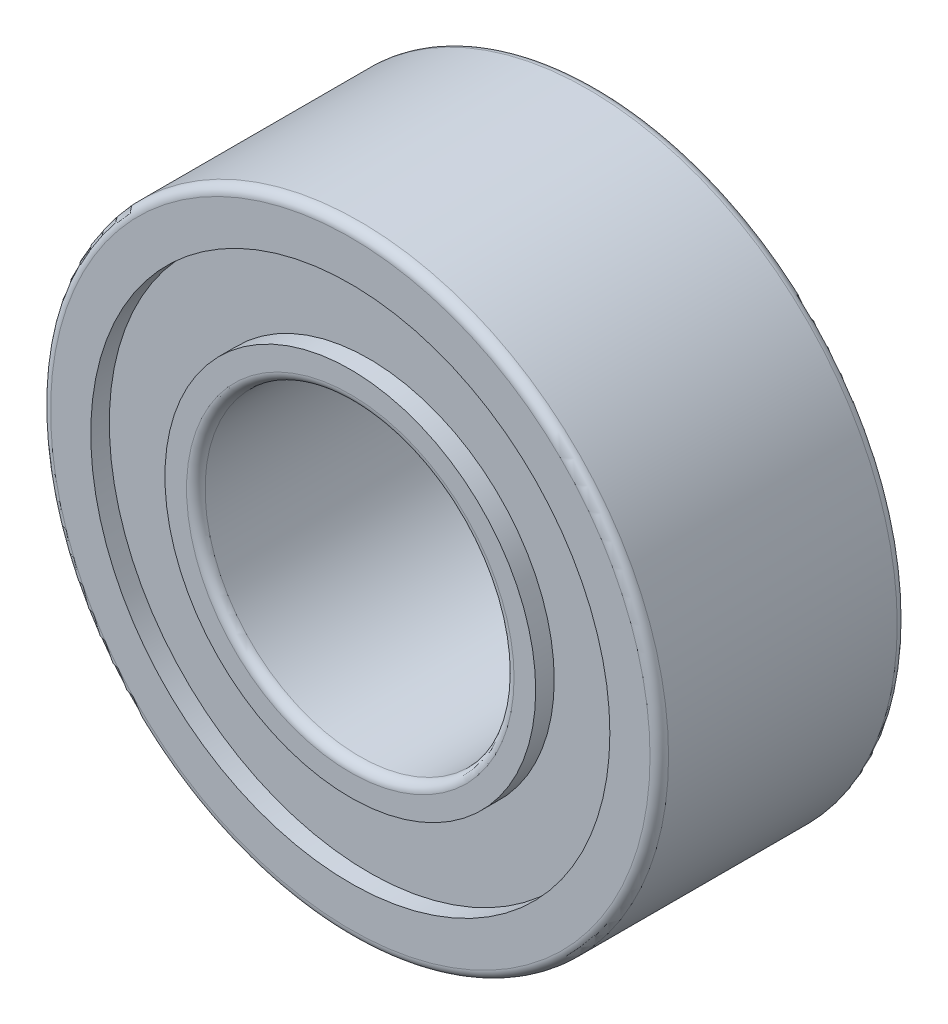
ISO-10303-21;
HEADER;
FILE_DESCRIPTION(('STEP AP214'),'2;1');
FILE_NAME('part.step','',(''),(''),'','','');
FILE_SCHEMA(('AUTOMOTIVE_DESIGN { 1 0 10303 214 1 1 1 1 }'));
ENDSEC;
DATA;
#1=APPLICATION_CONTEXT('core data for automotive mechanical design processes');
#2=APPLICATION_PROTOCOL_DEFINITION('international standard','automotive_design',2000,#1);
#3=PRODUCT_CONTEXT('',#1,'mechanical');
#4=PRODUCT('Part','Part','',(#3));
#5=PRODUCT_RELATED_PRODUCT_CATEGORY('part','',(#4));
#6=PRODUCT_DEFINITION_FORMATION('','',#4);
#7=PRODUCT_DEFINITION_CONTEXT('part definition',#1,'design');
#8=PRODUCT_DEFINITION('design','',#6,#7);
#9=PRODUCT_DEFINITION_SHAPE('','',#8);
#10=(LENGTH_UNIT() NAMED_UNIT(*) SI_UNIT(.MILLI.,.METRE.));
#11=(NAMED_UNIT(*) PLANE_ANGLE_UNIT() SI_UNIT($,.RADIAN.));
#12=(NAMED_UNIT(*) SI_UNIT($,.STERADIAN.) SOLID_ANGLE_UNIT());
#13=UNCERTAINTY_MEASURE_WITH_UNIT(LENGTH_MEASURE(1.E-05),#10,'distance_accuracy_value','');
#14=(GEOMETRIC_REPRESENTATION_CONTEXT(3) GLOBAL_UNCERTAINTY_ASSIGNED_CONTEXT((#13)) GLOBAL_UNIT_ASSIGNED_CONTEXT((#10,
#11,#12)) REPRESENTATION_CONTEXT('',''));
#15=CARTESIAN_POINT('',(0.,0.,0.));
#16=DIRECTION('',(0.,0.,1.));
#17=DIRECTION('',(1.,0.,0.));
#18=AXIS2_PLACEMENT_3D('',#15,#16,#17);
#19=CARTESIAN_POINT('',(0.,0.,0.));
#20=DIRECTION('',(0.,0.,1.));
#21=DIRECTION('',(1.,0.,0.));
#22=AXIS2_PLACEMENT_3D('',#19,#20,#21);
#23=PLANE('',#22);
#24=CARTESIAN_POINT('',(0.,0.,0.));
#25=DIRECTION('',(0.,0.,1.));
#26=DIRECTION('',(1.,0.,0.));
#27=AXIS2_PLACEMENT_3D('',#24,#25,#26);
#28=CIRCLE('',#27,2.65);
#29=CARTESIAN_POINT('',(2.65,0.,0.));
#30=VERTEX_POINT('',#29);
#31=EDGE_CURVE('E62',#30,#30,#28,.T.);
#32=ORIENTED_EDGE('',*,*,#31,.T.);
#33=EDGE_LOOP('',(#32));
#34=FACE_BOUND('',#33,.T.);
#35=CARTESIAN_POINT('',(0.,0.,0.));
#36=DIRECTION('',(0.,0.,1.));
#37=DIRECTION('',(1.,0.,0.));
#38=AXIS2_PLACEMENT_3D('',#35,#36,#37);
#39=CIRCLE('',#38,3.);
#40=CARTESIAN_POINT('',(3.,0.,0.));
#41=VERTEX_POINT('',#40);
#42=EDGE_CURVE('E84',#41,#41,#39,.T.);
#43=ORIENTED_EDGE('',*,*,#42,.F.);
#44=EDGE_LOOP('',(#43));
#45=FACE_BOUND('',#44,.T.);
#46=ADVANCED_FACE('F33',(#34,#45),#23,.F.);
#47=CARTESIAN_POINT('',(0.,0.,4.));
#48=DIRECTION('',(0.,0.,1.));
#49=DIRECTION('',(1.,0.,0.));
#50=AXIS2_PLACEMENT_3D('',#47,#48,#49);
#51=PLANE('',#50);
#52=CARTESIAN_POINT('',(0.,0.,4.));
#53=DIRECTION('',(0.,0.,1.));
#54=DIRECTION('',(1.,0.,0.));
#55=AXIS2_PLACEMENT_3D('',#52,#53,#54);
#56=CIRCLE('',#55,2.65);
#57=CARTESIAN_POINT('',(2.65,0.,4.));
#58=VERTEX_POINT('',#57);
#59=EDGE_CURVE('E40',#58,#58,#56,.F.);
#60=ORIENTED_EDGE('',*,*,#59,.T.);
#61=EDGE_LOOP('',(#60));
#62=FACE_BOUND('',#61,.T.);
#63=CARTESIAN_POINT('',(0.,0.,4.));
#64=DIRECTION('',(0.,0.,1.));
#65=DIRECTION('',(1.,0.,0.));
#66=AXIS2_PLACEMENT_3D('',#63,#64,#65);
#67=CIRCLE('',#66,3.);
#68=CARTESIAN_POINT('',(3.,0.,4.));
#69=VERTEX_POINT('',#68);
#70=EDGE_CURVE('E72',#69,#69,#67,.T.);
#71=ORIENTED_EDGE('',*,*,#70,.T.);
#72=EDGE_LOOP('',(#71));
#73=FACE_BOUND('',#72,.T.);
#74=ADVANCED_FACE('F101',(#62,#73),#51,.T.);
#75=CARTESIAN_POINT('',(0.,0.,4.));
#76=DIRECTION('',(0.,0.,1.));
#77=DIRECTION('',(1.,0.,0.));
#78=AXIS2_PLACEMENT_3D('',#75,#76,#77);
#79=CIRCLE('',#78,4.85);
#80=CARTESIAN_POINT('',(4.85,0.,4.));
#81=VERTEX_POINT('',#80);
#82=EDGE_CURVE('E10',#81,#81,#79,.T.);
#83=ORIENTED_EDGE('',*,*,#82,.T.);
#84=EDGE_LOOP('',(#83));
#85=FACE_BOUND('',#84,.T.);
#86=CARTESIAN_POINT('',(0.,0.,4.));
#87=DIRECTION('',(0.,0.,1.));
#88=DIRECTION('',(1.,0.,0.));
#89=AXIS2_PLACEMENT_3D('',#86,#87,#88);
#90=CIRCLE('',#89,4.2);
#91=CARTESIAN_POINT('',(4.2,0.,4.));
#92=VERTEX_POINT('',#91);
#93=EDGE_CURVE('E66',#92,#92,#90,.T.);
#94=ORIENTED_EDGE('',*,*,#93,.F.);
#95=EDGE_LOOP('',(#94));
#96=FACE_BOUND('',#95,.T.);
#97=ADVANCED_FACE('F108',(#85,#96),#51,.T.);
#98=CARTESIAN_POINT('',(0.,0.,0.));
#99=DIRECTION('',(0.,0.,1.));
#100=DIRECTION('',(1.,0.,0.));
#101=AXIS2_PLACEMENT_3D('',#98,#99,#100);
#102=CIRCLE('',#101,4.85);
#103=CARTESIAN_POINT('',(4.85,0.,0.));
#104=VERTEX_POINT('',#103);
#105=EDGE_CURVE('E44',#104,#104,#102,.F.);
#106=ORIENTED_EDGE('',*,*,#105,.T.);
#107=EDGE_LOOP('',(#106));
#108=FACE_BOUND('',#107,.T.);
#109=CARTESIAN_POINT('',(0.,0.,0.));
#110=DIRECTION('',(0.,0.,1.));
#111=DIRECTION('',(1.,0.,0.));
#112=AXIS2_PLACEMENT_3D('',#109,#110,#111);
#113=CIRCLE('',#112,4.2);
#114=CARTESIAN_POINT('',(4.2,0.,0.));
#115=VERTEX_POINT('',#114);
#116=EDGE_CURVE('E78',#115,#115,#113,.T.);
#117=ORIENTED_EDGE('',*,*,#116,.T.);
#118=EDGE_LOOP('',(#117));
#119=FACE_BOUND('',#118,.T.);
#120=ADVANCED_FACE('F104',(#108,#119),#23,.F.);
#121=CARTESIAN_POINT('',(0.,0.,4.));
#122=DIRECTION('',(0.,0.,-1.));
#123=DIRECTION('',(-1.,0.,0.));
#124=AXIS2_PLACEMENT_3D('',#121,#122,#123);
#125=CYLINDRICAL_SURFACE('',#124,5.);
#126=CARTESIAN_POINT('',(0.,0.,0.15));
#127=DIRECTION('',(0.,0.,1.));
#128=DIRECTION('',(1.,0.,0.));
#129=AXIS2_PLACEMENT_3D('',#126,#127,#128);
#130=CIRCLE('',#129,5.);
#131=CARTESIAN_POINT('',(5.,0.,0.15));
#132=VERTEX_POINT('',#131);
#133=EDGE_CURVE('E48',#132,#132,#130,.T.);
#134=ORIENTED_EDGE('',*,*,#133,.T.);
#135=EDGE_LOOP('',(#134));
#136=FACE_BOUND('',#135,.T.);
#137=CARTESIAN_POINT('',(0.,0.,3.85));
#138=DIRECTION('',(0.,0.,1.));
#139=DIRECTION('',(1.,0.,0.));
#140=AXIS2_PLACEMENT_3D('',#137,#138,#139);
#141=CIRCLE('',#140,5.);
#142=CARTESIAN_POINT('',(5.,0.,3.85));
#143=VERTEX_POINT('',#142);
#144=EDGE_CURVE('E53',#143,#143,#141,.F.);
#145=ORIENTED_EDGE('',*,*,#144,.T.);
#146=EDGE_LOOP('',(#145));
#147=FACE_BOUND('',#146,.T.);
#148=ADVANCED_FACE('F112',(#136,#147),#125,.T.);
#149=CARTESIAN_POINT('',(0.,0.,4.));
#150=DIRECTION('',(0.,0.,-1.));
#151=DIRECTION('',(-1.,0.,0.));
#152=AXIS2_PLACEMENT_3D('',#149,#150,#151);
#153=CYLINDRICAL_SURFACE('',#152,2.5);
#154=CARTESIAN_POINT('',(0.,0.,0.15));
#155=DIRECTION('',(0.,0.,1.));
#156=DIRECTION('',(1.,0.,0.));
#157=AXIS2_PLACEMENT_3D('',#154,#155,#156);
#158=CIRCLE('',#157,2.5);
#159=CARTESIAN_POINT('',(2.5,0.,0.15));
#160=VERTEX_POINT('',#159);
#161=EDGE_CURVE('E56',#160,#160,#158,.F.);
#162=ORIENTED_EDGE('',*,*,#161,.T.);
#163=EDGE_LOOP('',(#162));
#164=FACE_BOUND('',#163,.T.);
#165=CARTESIAN_POINT('',(0.,0.,3.85));
#166=DIRECTION('',(0.,0.,1.));
#167=DIRECTION('',(1.,0.,0.));
#168=AXIS2_PLACEMENT_3D('',#165,#166,#167);
#169=CIRCLE('',#168,2.5);
#170=CARTESIAN_POINT('',(2.5,0.,3.85));
#171=VERTEX_POINT('',#170);
#172=EDGE_CURVE('E59',#171,#171,#169,.T.);
#173=ORIENTED_EDGE('',*,*,#172,.T.);
#174=EDGE_LOOP('',(#173));
#175=FACE_BOUND('',#174,.T.);
#176=ADVANCED_FACE('F118',(#164,#175),#153,.F.);
#177=CARTESIAN_POINT('',(0.,0.,3.7));
#178=DIRECTION('',(0.,0.,1.));
#179=DIRECTION('',(1.,0.,0.));
#180=AXIS2_PLACEMENT_3D('',#177,#178,#179);
#181=CYLINDRICAL_SURFACE('',#180,4.2);
#182=CARTESIAN_POINT('',(0.,0.,3.7));
#183=DIRECTION('',(0.,0.,1.));
#184=DIRECTION('',(1.,0.,0.));
#185=AXIS2_PLACEMENT_3D('',#182,#183,#184);
#186=CIRCLE('',#185,4.2);
#187=CARTESIAN_POINT('',(4.2,0.,3.7));
#188=VERTEX_POINT('',#187);
#189=EDGE_CURVE('E65',#188,#188,#186,.T.);
#190=ORIENTED_EDGE('',*,*,#189,.F.);
#191=EDGE_LOOP('',(#190));
#192=FACE_BOUND('',#191,.T.);
#193=ORIENTED_EDGE('',*,*,#93,.T.);
#194=EDGE_LOOP('',(#193));
#195=FACE_BOUND('',#194,.T.);
#196=ADVANCED_FACE('F140',(#192,#195),#181,.F.);
#197=CARTESIAN_POINT('',(0.,0.,3.7));
#198=DIRECTION('',(0.,0.,1.));
#199=DIRECTION('',(1.,0.,0.));
#200=AXIS2_PLACEMENT_3D('',#197,#198,#199);
#201=PLANE('',#200);
#202=CARTESIAN_POINT('',(0.,0.,3.7));
#203=DIRECTION('',(0.,0.,1.));
#204=DIRECTION('',(1.,0.,0.));
#205=AXIS2_PLACEMENT_3D('',#202,#203,#204);
#206=CIRCLE('',#205,3.);
#207=CARTESIAN_POINT('',(3.,0.,3.7));
#208=VERTEX_POINT('',#207);
#209=EDGE_CURVE('E69',#208,#208,#206,.T.);
#210=ORIENTED_EDGE('',*,*,#209,.F.);
#211=EDGE_LOOP('',(#210));
#212=FACE_BOUND('',#211,.T.);
#213=ORIENTED_EDGE('',*,*,#189,.T.);
#214=EDGE_LOOP('',(#213));
#215=FACE_BOUND('',#214,.T.);
#216=ADVANCED_FACE('F136',(#212,#215),#201,.T.);
#217=CARTESIAN_POINT('',(0.,0.,3.7));
#218=DIRECTION('',(0.,0.,1.));
#219=DIRECTION('',(1.,0.,0.));
#220=AXIS2_PLACEMENT_3D('',#217,#218,#219);
#221=CYLINDRICAL_SURFACE('',#220,3.);
#222=ORIENTED_EDGE('',*,*,#209,.T.);
#223=EDGE_LOOP('',(#222));
#224=FACE_BOUND('',#223,.T.);
#225=ORIENTED_EDGE('',*,*,#70,.F.);
#226=EDGE_LOOP('',(#225));
#227=FACE_BOUND('',#226,.T.);
#228=ADVANCED_FACE('F130',(#224,#227),#221,.T.);
#229=CARTESIAN_POINT('',(0.,0.,0.5));
#230=DIRECTION('',(0.,0.,1.));
#231=DIRECTION('',(1.,0.,0.));
#232=AXIS2_PLACEMENT_3D('',#229,#230,#231);
#233=PLANE('',#232);
#234=CARTESIAN_POINT('',(0.,0.,0.5));
#235=DIRECTION('',(0.,0.,1.));
#236=DIRECTION('',(1.,0.,0.));
#237=AXIS2_PLACEMENT_3D('',#234,#235,#236);
#238=CIRCLE('',#237,4.2);
#239=CARTESIAN_POINT('',(4.2,0.,0.5));
#240=VERTEX_POINT('',#239);
#241=EDGE_CURVE('E75',#240,#240,#238,.T.);
#242=ORIENTED_EDGE('',*,*,#241,.F.);
#243=EDGE_LOOP('',(#242));
#244=FACE_BOUND('',#243,.T.);
#245=CARTESIAN_POINT('',(0.,0.,0.5));
#246=DIRECTION('',(0.,0.,1.));
#247=DIRECTION('',(1.,0.,0.));
#248=AXIS2_PLACEMENT_3D('',#245,#246,#247);
#249=CIRCLE('',#248,3.);
#250=CARTESIAN_POINT('',(3.,0.,0.5));
#251=VERTEX_POINT('',#250);
#252=EDGE_CURVE('E81',#251,#251,#249,.T.);
#253=ORIENTED_EDGE('',*,*,#252,.T.);
#254=EDGE_LOOP('',(#253));
#255=FACE_BOUND('',#254,.T.);
#256=ADVANCED_FACE('F90',(#244,#255),#233,.F.);
#257=CARTESIAN_POINT('',(0.,0.,0.5));
#258=DIRECTION('',(0.,0.,-1.));
#259=DIRECTION('',(-1.,0.,0.));
#260=AXIS2_PLACEMENT_3D('',#257,#258,#259);
#261=CYLINDRICAL_SURFACE('',#260,4.2);
#262=ORIENTED_EDGE('',*,*,#241,.T.);
#263=EDGE_LOOP('',(#262));
#264=FACE_BOUND('',#263,.T.);
#265=ORIENTED_EDGE('',*,*,#116,.F.);
#266=EDGE_LOOP('',(#265));
#267=FACE_BOUND('',#266,.T.);
#268=ADVANCED_FACE('F96',(#264,#267),#261,.F.);
#269=CARTESIAN_POINT('',(0.,0.,0.5));
#270=DIRECTION('',(0.,0.,-1.));
#271=DIRECTION('',(-1.,0.,0.));
#272=AXIS2_PLACEMENT_3D('',#269,#270,#271);
#273=CYLINDRICAL_SURFACE('',#272,3.);
#274=ORIENTED_EDGE('',*,*,#252,.F.);
#275=EDGE_LOOP('',(#274));
#276=FACE_BOUND('',#275,.T.);
#277=ORIENTED_EDGE('',*,*,#42,.T.);
#278=EDGE_LOOP('',(#277));
#279=FACE_BOUND('',#278,.T.);
#280=ADVANCED_FACE('F92',(#276,#279),#273,.T.);
#281=CARTESIAN_POINT('',(0.,0.,0.15));
#282=DIRECTION('',(0.,0.,1.));
#283=DIRECTION('',(1.,0.,0.));
#284=AXIS2_PLACEMENT_3D('',#281,#282,#283);
#285=TOROIDAL_SURFACE('',#284,2.65,0.15);
#286=ORIENTED_EDGE('',*,*,#161,.F.);
#287=EDGE_LOOP('',(#286));
#288=FACE_BOUND('',#287,.T.);
#289=ORIENTED_EDGE('',*,*,#31,.F.);
#290=EDGE_LOOP('',(#289));
#291=FACE_BOUND('',#290,.T.);
#292=ADVANCED_FACE('F95',(#288,#291),#285,.T.);
#293=CARTESIAN_POINT('',(0.,0.,0.15));
#294=DIRECTION('',(0.,0.,1.));
#295=DIRECTION('',(1.,0.,0.));
#296=AXIS2_PLACEMENT_3D('',#293,#294,#295);
#297=TOROIDAL_SURFACE('',#296,4.85,0.15);
#298=ORIENTED_EDGE('',*,*,#105,.F.);
#299=EDGE_LOOP('',(#298));
#300=FACE_BOUND('',#299,.T.);
#301=ORIENTED_EDGE('',*,*,#133,.F.);
#302=EDGE_LOOP('',(#301));
#303=FACE_BOUND('',#302,.T.);
#304=ADVANCED_FACE('F155',(#300,#303),#297,.T.);
#305=CARTESIAN_POINT('',(0.,0.,3.85));
#306=DIRECTION('',(0.,0.,1.));
#307=DIRECTION('',(1.,0.,0.));
#308=AXIS2_PLACEMENT_3D('',#305,#306,#307);
#309=TOROIDAL_SURFACE('',#308,2.65,0.15);
#310=ORIENTED_EDGE('',*,*,#59,.F.);
#311=EDGE_LOOP('',(#310));
#312=FACE_BOUND('',#311,.T.);
#313=ORIENTED_EDGE('',*,*,#172,.F.);
#314=EDGE_LOOP('',(#313));
#315=FACE_BOUND('',#314,.T.);
#316=ADVANCED_FACE('F153',(#312,#315),#309,.T.);
#317=CARTESIAN_POINT('',(0.,0.,3.85));
#318=DIRECTION('',(0.,0.,1.));
#319=DIRECTION('',(1.,0.,0.));
#320=AXIS2_PLACEMENT_3D('',#317,#318,#319);
#321=TOROIDAL_SURFACE('',#320,4.85,0.15);
#322=ORIENTED_EDGE('',*,*,#144,.F.);
#323=EDGE_LOOP('',(#322));
#324=FACE_BOUND('',#323,.T.);
#325=ORIENTED_EDGE('',*,*,#82,.F.);
#326=EDGE_LOOP('',(#325));
#327=FACE_BOUND('',#326,.T.);
#328=ADVANCED_FACE('F35',(#324,#327),#321,.T.);
#329=CLOSED_SHELL('',(#46,#74,#97,#120,#148,#176,#196,#216,#228,#256,#268,#280,#292,#304,#316,#328));
#330=MANIFOLD_SOLID_BREP('B2',#329);
#331=ADVANCED_BREP_SHAPE_REPRESENTATION('',(#18,#330),#14);
#332=SHAPE_DEFINITION_REPRESENTATION(#9,#331);
ENDSEC;
END-ISO-10303-21;
